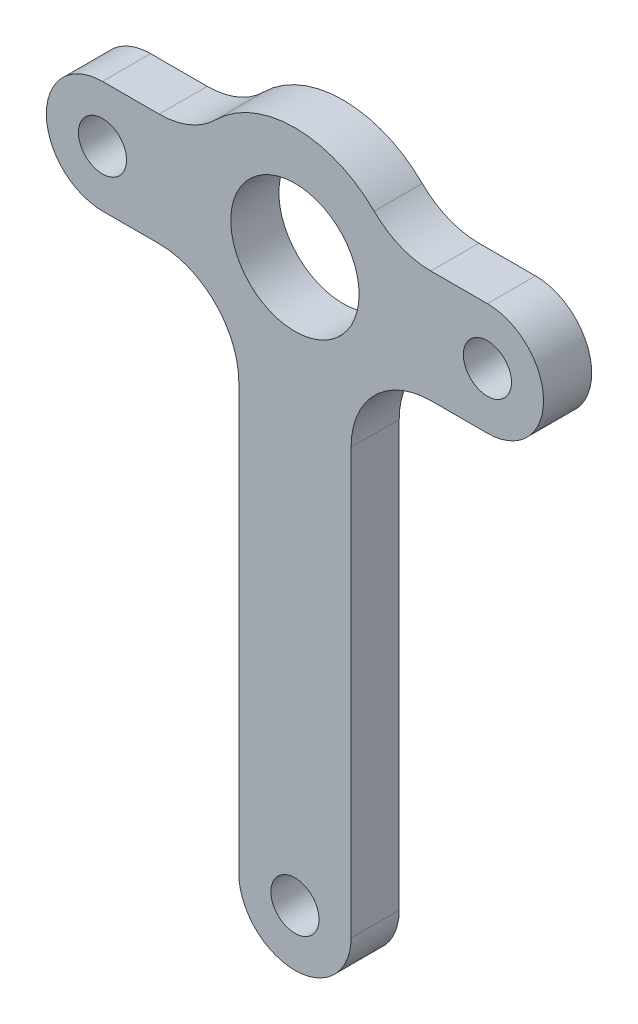
ISO-10303-21;
HEADER;
FILE_DESCRIPTION(('STEP AP214'),'2;1');
FILE_NAME('part.step','',(''),(''),'','','');
FILE_SCHEMA(('AUTOMOTIVE_DESIGN { 1 0 10303 214 1 1 1 1 }'));
ENDSEC;
DATA;
#1=APPLICATION_CONTEXT('core data for automotive mechanical design processes');
#2=APPLICATION_PROTOCOL_DEFINITION('international standard','automotive_design',2000,#1);
#3=PRODUCT_CONTEXT('',#1,'mechanical');
#4=PRODUCT('Part','Part','',(#3));
#5=PRODUCT_RELATED_PRODUCT_CATEGORY('part','',(#4));
#6=PRODUCT_DEFINITION_FORMATION('','',#4);
#7=PRODUCT_DEFINITION_CONTEXT('part definition',#1,'design');
#8=PRODUCT_DEFINITION('design','',#6,#7);
#9=PRODUCT_DEFINITION_SHAPE('','',#8);
#10=(LENGTH_UNIT() NAMED_UNIT(*) SI_UNIT(.MILLI.,.METRE.));
#11=(NAMED_UNIT(*) PLANE_ANGLE_UNIT() SI_UNIT($,.RADIAN.));
#12=(NAMED_UNIT(*) SI_UNIT($,.STERADIAN.) SOLID_ANGLE_UNIT());
#13=UNCERTAINTY_MEASURE_WITH_UNIT(LENGTH_MEASURE(1.E-05),#10,'distance_accuracy_value','');
#14=(GEOMETRIC_REPRESENTATION_CONTEXT(3) GLOBAL_UNCERTAINTY_ASSIGNED_CONTEXT((#13)) GLOBAL_UNIT_ASSIGNED_CONTEXT((#10,
#11,#12)) REPRESENTATION_CONTEXT('',''));
#15=CARTESIAN_POINT('',(0.,0.,0.));
#16=DIRECTION('',(0.,0.,1.));
#17=DIRECTION('',(1.,0.,0.));
#18=AXIS2_PLACEMENT_3D('',#15,#16,#17);
#19=CARTESIAN_POINT('',(-12.,0.,3.));
#20=DIRECTION('',(0.,0.,1.));
#21=DIRECTION('',(1.,0.,0.));
#22=AXIS2_PLACEMENT_3D('',#19,#20,#21);
#23=PLANE('',#22);
#24=CARTESIAN_POINT('',(0.,-35.,3.));
#25=DIRECTION('',(0.,0.,1.));
#26=DIRECTION('',(1.,0.,0.));
#27=AXIS2_PLACEMENT_3D('',#24,#25,#26);
#28=CIRCLE('',#27,1.5);
#29=CARTESIAN_POINT('',(1.50000000000001,-35.,3.));
#30=VERTEX_POINT('',#29);
#31=EDGE_CURVE('E318',#30,#30,#28,.T.);
#32=ORIENTED_EDGE('',*,*,#31,.F.);
#33=EDGE_LOOP('',(#32));
#34=FACE_BOUND('',#33,.T.);
#35=CARTESIAN_POINT('',(0.,0.,3.));
#36=DIRECTION('',(0.,0.,1.));
#37=DIRECTION('',(1.,0.,0.));
#38=AXIS2_PLACEMENT_3D('',#35,#36,#37);
#39=CIRCLE('',#38,4.);
#40=CARTESIAN_POINT('',(4.,0.,3.));
#41=VERTEX_POINT('',#40);
#42=EDGE_CURVE('E171',#41,#41,#39,.T.);
#43=ORIENTED_EDGE('',*,*,#42,.F.);
#44=EDGE_LOOP('',(#43));
#45=FACE_BOUND('',#44,.T.);
#46=CARTESIAN_POINT('',(-12.,0.,3.));
#47=DIRECTION('',(0.,0.,1.));
#48=DIRECTION('',(1.,0.,0.));
#49=AXIS2_PLACEMENT_3D('',#46,#47,#48);
#50=CIRCLE('',#49,3.5);
#51=CARTESIAN_POINT('',(-12.,3.5,3.));
#52=VERTEX_POINT('',#51);
#53=CARTESIAN_POINT('',(-12.,-3.5,3.));
#54=VERTEX_POINT('',#53);
#55=EDGE_CURVE('E194',#52,#54,#50,.T.);
#56=ORIENTED_EDGE('',*,*,#55,.T.);
#57=DIRECTION('',(1.,0.,0.));
#58=VECTOR('',#57,1.);
#59=CARTESIAN_POINT('',(-12.,-3.5,3.));
#60=LINE('',#59,#58);
#61=CARTESIAN_POINT('',(-8.5,-3.5,3.));
#62=VERTEX_POINT('',#61);
#63=EDGE_CURVE('E112',#54,#62,#60,.T.);
#64=ORIENTED_EDGE('',*,*,#63,.T.);
#65=CARTESIAN_POINT('',(-8.5,-8.5,3.));
#66=DIRECTION('',(0.,0.,-1.));
#67=DIRECTION('',(-1.,0.,0.));
#68=AXIS2_PLACEMENT_3D('',#65,#66,#67);
#69=CIRCLE('',#68,5.);
#70=CARTESIAN_POINT('',(-3.5,-8.5,3.));
#71=VERTEX_POINT('',#70);
#72=EDGE_CURVE('E227',#62,#71,#69,.T.);
#73=ORIENTED_EDGE('',*,*,#72,.T.);
#74=DIRECTION('',(0.,-1.,0.));
#75=VECTOR('',#74,1.);
#76=CARTESIAN_POINT('',(-3.5,-8.5,3.));
#77=LINE('',#76,#75);
#78=CARTESIAN_POINT('',(-3.49999999999999,-35.,3.));
#79=VERTEX_POINT('',#78);
#80=EDGE_CURVE('E246',#71,#79,#77,.T.);
#81=ORIENTED_EDGE('',*,*,#80,.T.);
#82=CARTESIAN_POINT('',(0.,-35.,3.));
#83=DIRECTION('',(0.,0.,1.));
#84=DIRECTION('',(1.,0.,0.));
#85=AXIS2_PLACEMENT_3D('',#82,#83,#84);
#86=CIRCLE('',#85,3.5);
#87=CARTESIAN_POINT('',(3.50000000000001,-35.,3.));
#88=VERTEX_POINT('',#87);
#89=EDGE_CURVE('E243',#79,#88,#86,.T.);
#90=ORIENTED_EDGE('',*,*,#89,.T.);
#91=DIRECTION('',(0.,1.,0.));
#92=VECTOR('',#91,1.);
#93=CARTESIAN_POINT('',(3.5,-8.5,3.));
#94=LINE('',#93,#92);
#95=CARTESIAN_POINT('',(3.5,-8.5,3.));
#96=VERTEX_POINT('',#95);
#97=EDGE_CURVE('E245',#88,#96,#94,.T.);
#98=ORIENTED_EDGE('',*,*,#97,.T.);
#99=CARTESIAN_POINT('',(8.5,-8.5,3.));
#100=DIRECTION('',(0.,0.,-1.));
#101=DIRECTION('',(1.,0.,0.));
#102=AXIS2_PLACEMENT_3D('',#99,#100,#101);
#103=CIRCLE('',#102,5.);
#104=CARTESIAN_POINT('',(8.5,-3.5,3.));
#105=VERTEX_POINT('',#104);
#106=EDGE_CURVE('E248',#96,#105,#103,.T.);
#107=ORIENTED_EDGE('',*,*,#106,.T.);
#108=DIRECTION('',(1.,0.,0.));
#109=VECTOR('',#108,1.);
#110=CARTESIAN_POINT('',(12.,-3.5,3.));
#111=LINE('',#110,#109);
#112=CARTESIAN_POINT('',(12.,-3.5,3.));
#113=VERTEX_POINT('',#112);
#114=EDGE_CURVE('E254',#105,#113,#111,.T.);
#115=ORIENTED_EDGE('',*,*,#114,.T.);
#116=CARTESIAN_POINT('',(12.,0.,3.));
#117=DIRECTION('',(0.,0.,1.));
#118=DIRECTION('',(-1.,0.,0.));
#119=AXIS2_PLACEMENT_3D('',#116,#117,#118);
#120=CIRCLE('',#119,3.5);
#121=CARTESIAN_POINT('',(12.,3.5,3.));
#122=VERTEX_POINT('',#121);
#123=EDGE_CURVE('E256',#113,#122,#120,.T.);
#124=ORIENTED_EDGE('',*,*,#123,.T.);
#125=DIRECTION('',(-1.,0.,0.));
#126=VECTOR('',#125,1.);
#127=CARTESIAN_POINT('',(12.,3.5,3.));
#128=LINE('',#127,#126);
#129=CARTESIAN_POINT('',(8.47053717304872,3.5,3.));
#130=VERTEX_POINT('',#129);
#131=EDGE_CURVE('E258',#122,#130,#128,.T.);
#132=ORIENTED_EDGE('',*,*,#131,.T.);
#133=CARTESIAN_POINT('',(8.47053717304871,8.5,3.));
#134=DIRECTION('',(0.,0.,-1.));
#135=DIRECTION('',(-1.,0.,0.));
#136=AXIS2_PLACEMENT_3D('',#133,#134,#135);
#137=CIRCLE('',#136,5.);
#138=CARTESIAN_POINT('',(4.94114668427842,4.95833333333333,3.));
#139=VERTEX_POINT('',#138);
#140=EDGE_CURVE('E149',#130,#139,#137,.T.);
#141=ORIENTED_EDGE('',*,*,#140,.T.);
#142=CARTESIAN_POINT('',(0.,0.,3.));
#143=DIRECTION('',(0.,0.,1.));
#144=DIRECTION('',(-1.,0.,0.));
#145=AXIS2_PLACEMENT_3D('',#142,#143,#144);
#146=CIRCLE('',#145,7.);
#147=CARTESIAN_POINT('',(-4.94114668427841,4.95833333333333,3.));
#148=VERTEX_POINT('',#147);
#149=EDGE_CURVE('E143',#139,#148,#146,.T.);
#150=ORIENTED_EDGE('',*,*,#149,.T.);
#151=CARTESIAN_POINT('',(-8.47053717304871,8.5,3.));
#152=DIRECTION('',(0.,0.,-1.));
#153=DIRECTION('',(-1.,0.,0.));
#154=AXIS2_PLACEMENT_3D('',#151,#152,#153);
#155=CIRCLE('',#154,5.);
#156=CARTESIAN_POINT('',(-8.47053717304871,3.5,3.));
#157=VERTEX_POINT('',#156);
#158=EDGE_CURVE('E147',#148,#157,#155,.T.);
#159=ORIENTED_EDGE('',*,*,#158,.T.);
#160=DIRECTION('',(-1.,0.,0.));
#161=VECTOR('',#160,1.);
#162=CARTESIAN_POINT('',(-12.,3.5,3.));
#163=LINE('',#162,#161);
#164=EDGE_CURVE('E51',#157,#52,#163,.T.);
#165=ORIENTED_EDGE('',*,*,#164,.T.);
#166=EDGE_LOOP('',(#56,#64,#73,#81,#90,#98,#107,#115,#124,#132,#141,#150,#159,#165));
#167=FACE_BOUND('',#166,.T.);
#168=CARTESIAN_POINT('',(-12.,0.,3.));
#169=DIRECTION('',(0.,0.,1.));
#170=DIRECTION('',(1.,0.,0.));
#171=AXIS2_PLACEMENT_3D('',#168,#169,#170);
#172=CIRCLE('',#171,1.5);
#173=CARTESIAN_POINT('',(-10.5,0.,3.));
#174=VERTEX_POINT('',#173);
#175=EDGE_CURVE('E324',#174,#174,#172,.T.);
#176=ORIENTED_EDGE('',*,*,#175,.F.);
#177=EDGE_LOOP('',(#176));
#178=FACE_BOUND('',#177,.T.);
#179=CARTESIAN_POINT('',(12.,0.,3.));
#180=DIRECTION('',(0.,0.,1.));
#181=DIRECTION('',(1.,0.,0.));
#182=AXIS2_PLACEMENT_3D('',#179,#180,#181);
#183=CIRCLE('',#182,1.5);
#184=CARTESIAN_POINT('',(13.5,0.,3.));
#185=VERTEX_POINT('',#184);
#186=EDGE_CURVE('E309',#185,#185,#183,.T.);
#187=ORIENTED_EDGE('',*,*,#186,.F.);
#188=EDGE_LOOP('',(#187));
#189=FACE_BOUND('',#188,.T.);
#190=ADVANCED_FACE('F34',(#34,#45,#167,#178,#189),#23,.T.);
#191=CARTESIAN_POINT('',(-12.,0.,0.));
#192=DIRECTION('',(0.,0.,1.));
#193=DIRECTION('',(1.,0.,0.));
#194=AXIS2_PLACEMENT_3D('',#191,#192,#193);
#195=PLANE('',#194);
#196=CARTESIAN_POINT('',(-12.,0.,0.));
#197=DIRECTION('',(0.,0.,1.));
#198=DIRECTION('',(1.,0.,0.));
#199=AXIS2_PLACEMENT_3D('',#196,#197,#198);
#200=CIRCLE('',#199,3.5);
#201=CARTESIAN_POINT('',(-12.,3.5,0.));
#202=VERTEX_POINT('',#201);
#203=CARTESIAN_POINT('',(-12.,-3.5,0.));
#204=VERTEX_POINT('',#203);
#205=EDGE_CURVE('E167',#202,#204,#200,.T.);
#206=ORIENTED_EDGE('',*,*,#205,.F.);
#207=DIRECTION('',(-1.,0.,0.));
#208=VECTOR('',#207,1.);
#209=CARTESIAN_POINT('',(-12.,3.5,0.));
#210=LINE('',#209,#208);
#211=CARTESIAN_POINT('',(-8.47053717304871,3.5,0.));
#212=VERTEX_POINT('',#211);
#213=EDGE_CURVE('E104',#212,#202,#210,.T.);
#214=ORIENTED_EDGE('',*,*,#213,.F.);
#215=CARTESIAN_POINT('',(-8.47053717304871,8.5,0.));
#216=DIRECTION('',(0.,0.,-1.));
#217=DIRECTION('',(-1.,0.,0.));
#218=AXIS2_PLACEMENT_3D('',#215,#216,#217);
#219=CIRCLE('',#218,5.);
#220=CARTESIAN_POINT('',(-4.94114668427841,4.95833333333333,0.));
#221=VERTEX_POINT('',#220);
#222=EDGE_CURVE('E98',#221,#212,#219,.T.);
#223=ORIENTED_EDGE('',*,*,#222,.F.);
#224=CARTESIAN_POINT('',(0.,0.,0.));
#225=DIRECTION('',(0.,0.,1.));
#226=DIRECTION('',(-1.,0.,0.));
#227=AXIS2_PLACEMENT_3D('',#224,#225,#226);
#228=CIRCLE('',#227,7.);
#229=CARTESIAN_POINT('',(4.94114668427842,4.95833333333333,0.));
#230=VERTEX_POINT('',#229);
#231=EDGE_CURVE('E157',#230,#221,#228,.T.);
#232=ORIENTED_EDGE('',*,*,#231,.F.);
#233=CARTESIAN_POINT('',(8.47053717304871,8.5,0.));
#234=DIRECTION('',(0.,0.,-1.));
#235=DIRECTION('',(-1.,0.,0.));
#236=AXIS2_PLACEMENT_3D('',#233,#234,#235);
#237=CIRCLE('',#236,5.);
#238=CARTESIAN_POINT('',(8.47053717304872,3.5,0.));
#239=VERTEX_POINT('',#238);
#240=EDGE_CURVE('E189',#239,#230,#237,.T.);
#241=ORIENTED_EDGE('',*,*,#240,.F.);
#242=DIRECTION('',(-1.,0.,0.));
#243=VECTOR('',#242,1.);
#244=CARTESIAN_POINT('',(12.,3.5,0.));
#245=LINE('',#244,#243);
#246=CARTESIAN_POINT('',(12.,3.5,0.));
#247=VERTEX_POINT('',#246);
#248=EDGE_CURVE('E187',#247,#239,#245,.T.);
#249=ORIENTED_EDGE('',*,*,#248,.F.);
#250=CARTESIAN_POINT('',(12.,0.,0.));
#251=DIRECTION('',(0.,0.,1.));
#252=DIRECTION('',(-1.,0.,0.));
#253=AXIS2_PLACEMENT_3D('',#250,#251,#252);
#254=CIRCLE('',#253,3.5);
#255=CARTESIAN_POINT('',(12.,-3.5,0.));
#256=VERTEX_POINT('',#255);
#257=EDGE_CURVE('E185',#256,#247,#254,.T.);
#258=ORIENTED_EDGE('',*,*,#257,.F.);
#259=DIRECTION('',(1.,0.,0.));
#260=VECTOR('',#259,1.);
#261=CARTESIAN_POINT('',(12.,-3.5,0.));
#262=LINE('',#261,#260);
#263=CARTESIAN_POINT('',(8.5,-3.5,0.));
#264=VERTEX_POINT('',#263);
#265=EDGE_CURVE('E183',#264,#256,#262,.T.);
#266=ORIENTED_EDGE('',*,*,#265,.F.);
#267=CARTESIAN_POINT('',(8.5,-8.5,0.));
#268=DIRECTION('',(0.,0.,-1.));
#269=DIRECTION('',(1.,0.,0.));
#270=AXIS2_PLACEMENT_3D('',#267,#268,#269);
#271=CIRCLE('',#270,5.);
#272=CARTESIAN_POINT('',(3.5,-8.5,0.));
#273=VERTEX_POINT('',#272);
#274=EDGE_CURVE('E181',#273,#264,#271,.T.);
#275=ORIENTED_EDGE('',*,*,#274,.F.);
#276=DIRECTION('',(0.,1.,0.));
#277=VECTOR('',#276,1.);
#278=CARTESIAN_POINT('',(3.5,-8.5,0.));
#279=LINE('',#278,#277);
#280=CARTESIAN_POINT('',(3.50000000000001,-35.,0.));
#281=VERTEX_POINT('',#280);
#282=EDGE_CURVE('E179',#281,#273,#279,.T.);
#283=ORIENTED_EDGE('',*,*,#282,.F.);
#284=CARTESIAN_POINT('',(0.,-35.,0.));
#285=DIRECTION('',(0.,0.,1.));
#286=DIRECTION('',(1.,0.,0.));
#287=AXIS2_PLACEMENT_3D('',#284,#285,#286);
#288=CIRCLE('',#287,3.5);
#289=CARTESIAN_POINT('',(-3.49999999999999,-35.,0.));
#290=VERTEX_POINT('',#289);
#291=EDGE_CURVE('E177',#290,#281,#288,.T.);
#292=ORIENTED_EDGE('',*,*,#291,.F.);
#293=DIRECTION('',(0.,-1.,0.));
#294=VECTOR('',#293,1.);
#295=CARTESIAN_POINT('',(-3.5,-8.5,0.));
#296=LINE('',#295,#294);
#297=CARTESIAN_POINT('',(-3.5,-8.5,0.));
#298=VERTEX_POINT('',#297);
#299=EDGE_CURVE('E175',#298,#290,#296,.T.);
#300=ORIENTED_EDGE('',*,*,#299,.F.);
#301=CARTESIAN_POINT('',(-8.5,-8.5,0.));
#302=DIRECTION('',(0.,0.,-1.));
#303=DIRECTION('',(-1.,0.,0.));
#304=AXIS2_PLACEMENT_3D('',#301,#302,#303);
#305=CIRCLE('',#304,5.);
#306=CARTESIAN_POINT('',(-8.5,-3.5,0.));
#307=VERTEX_POINT('',#306);
#308=EDGE_CURVE('E173',#307,#298,#305,.T.);
#309=ORIENTED_EDGE('',*,*,#308,.F.);
#310=DIRECTION('',(1.,0.,0.));
#311=VECTOR('',#310,1.);
#312=CARTESIAN_POINT('',(-12.,-3.5,0.));
#313=LINE('',#312,#311);
#314=EDGE_CURVE('E170',#204,#307,#313,.T.);
#315=ORIENTED_EDGE('',*,*,#314,.F.);
#316=EDGE_LOOP('',(#206,#214,#223,#232,#241,#249,#258,#266,#275,#283,#292,#300,#309,#315));
#317=FACE_BOUND('',#316,.T.);
#318=CARTESIAN_POINT('',(0.,0.,0.));
#319=DIRECTION('',(0.,0.,1.));
#320=DIRECTION('',(1.,0.,0.));
#321=AXIS2_PLACEMENT_3D('',#318,#319,#320);
#322=CIRCLE('',#321,4.);
#323=CARTESIAN_POINT('',(4.,0.,0.));
#324=VERTEX_POINT('',#323);
#325=EDGE_CURVE('E327',#324,#324,#322,.T.);
#326=ORIENTED_EDGE('',*,*,#325,.T.);
#327=EDGE_LOOP('',(#326));
#328=FACE_BOUND('',#327,.T.);
#329=CARTESIAN_POINT('',(-12.,0.,0.));
#330=DIRECTION('',(0.,0.,1.));
#331=DIRECTION('',(1.,0.,0.));
#332=AXIS2_PLACEMENT_3D('',#329,#330,#331);
#333=CIRCLE('',#332,1.5);
#334=CARTESIAN_POINT('',(-10.5,0.,0.));
#335=VERTEX_POINT('',#334);
#336=EDGE_CURVE('E321',#335,#335,#333,.T.);
#337=ORIENTED_EDGE('',*,*,#336,.T.);
#338=EDGE_LOOP('',(#337));
#339=FACE_BOUND('',#338,.T.);
#340=CARTESIAN_POINT('',(0.,-35.,0.));
#341=DIRECTION('',(0.,0.,1.));
#342=DIRECTION('',(1.,0.,0.));
#343=AXIS2_PLACEMENT_3D('',#340,#341,#342);
#344=CIRCLE('',#343,1.5);
#345=CARTESIAN_POINT('',(1.50000000000001,-35.,0.));
#346=VERTEX_POINT('',#345);
#347=EDGE_CURVE('E315',#346,#346,#344,.T.);
#348=ORIENTED_EDGE('',*,*,#347,.T.);
#349=EDGE_LOOP('',(#348));
#350=FACE_BOUND('',#349,.T.);
#351=CARTESIAN_POINT('',(12.,0.,0.));
#352=DIRECTION('',(0.,0.,1.));
#353=DIRECTION('',(1.,0.,0.));
#354=AXIS2_PLACEMENT_3D('',#351,#352,#353);
#355=CIRCLE('',#354,1.5);
#356=CARTESIAN_POINT('',(13.5,0.,0.));
#357=VERTEX_POINT('',#356);
#358=EDGE_CURVE('E312',#357,#357,#355,.T.);
#359=ORIENTED_EDGE('',*,*,#358,.T.);
#360=EDGE_LOOP('',(#359));
#361=FACE_BOUND('',#360,.T.);
#362=ADVANCED_FACE('F231',(#317,#328,#339,#350,#361),#195,.F.);
#363=CARTESIAN_POINT('',(-12.,0.,3.));
#364=DIRECTION('',(0.,0.,-1.));
#365=DIRECTION('',(-1.,0.,0.));
#366=AXIS2_PLACEMENT_3D('',#363,#364,#365);
#367=CYLINDRICAL_SURFACE('',#366,3.5);
#368=ORIENTED_EDGE('',*,*,#205,.T.);
#369=DIRECTION('',(0.,0.,-1.));
#370=VECTOR('',#369,1.);
#371=CARTESIAN_POINT('',(-12.,-3.5,3.));
#372=LINE('',#371,#370);
#373=EDGE_CURVE('E11',#54,#204,#372,.T.);
#374=ORIENTED_EDGE('',*,*,#373,.F.);
#375=ORIENTED_EDGE('',*,*,#55,.F.);
#376=DIRECTION('',(0.,0.,-1.));
#377=VECTOR('',#376,1.);
#378=CARTESIAN_POINT('',(-12.,3.5,3.));
#379=LINE('',#378,#377);
#380=EDGE_CURVE('E163',#52,#202,#379,.T.);
#381=ORIENTED_EDGE('',*,*,#380,.T.);
#382=EDGE_LOOP('',(#368,#374,#375,#381));
#383=FACE_BOUND('',#382,.T.);
#384=ADVANCED_FACE('F36',(#383),#367,.T.);
#385=CARTESIAN_POINT('',(-12.,-3.5,3.));
#386=DIRECTION('',(0.,1.,0.));
#387=DIRECTION('',(-1.,0.,0.));
#388=AXIS2_PLACEMENT_3D('',#385,#386,#387);
#389=PLANE('',#388);
#390=ORIENTED_EDGE('',*,*,#314,.T.);
#391=DIRECTION('',(0.,0.,-1.));
#392=VECTOR('',#391,1.);
#393=CARTESIAN_POINT('',(-8.5,-3.5,3.));
#394=LINE('',#393,#392);
#395=EDGE_CURVE('E43',#62,#307,#394,.T.);
#396=ORIENTED_EDGE('',*,*,#395,.F.);
#397=ORIENTED_EDGE('',*,*,#63,.F.);
#398=ORIENTED_EDGE('',*,*,#373,.T.);
#399=EDGE_LOOP('',(#390,#396,#397,#398));
#400=FACE_BOUND('',#399,.T.);
#401=ADVANCED_FACE('F457',(#400),#389,.F.);
#402=CARTESIAN_POINT('',(-8.5,-8.5,3.));
#403=DIRECTION('',(0.,0.,-1.));
#404=DIRECTION('',(-1.,0.,0.));
#405=AXIS2_PLACEMENT_3D('',#402,#403,#404);
#406=CYLINDRICAL_SURFACE('',#405,5.);
#407=ORIENTED_EDGE('',*,*,#308,.T.);
#408=DIRECTION('',(0.,0.,-1.));
#409=VECTOR('',#408,1.);
#410=CARTESIAN_POINT('',(-3.5,-8.5,3.));
#411=LINE('',#410,#409);
#412=EDGE_CURVE('E219',#71,#298,#411,.T.);
#413=ORIENTED_EDGE('',*,*,#412,.F.);
#414=ORIENTED_EDGE('',*,*,#72,.F.);
#415=ORIENTED_EDGE('',*,*,#395,.T.);
#416=EDGE_LOOP('',(#407,#413,#414,#415));
#417=FACE_BOUND('',#416,.T.);
#418=ADVANCED_FACE('F225',(#417),#406,.F.);
#419=CARTESIAN_POINT('',(-3.5,-8.5,3.));
#420=DIRECTION('',(1.,0.,0.));
#421=DIRECTION('',(0.,1.,0.));
#422=AXIS2_PLACEMENT_3D('',#419,#420,#421);
#423=PLANE('',#422);
#424=ORIENTED_EDGE('',*,*,#299,.T.);
#425=DIRECTION('',(0.,0.,-1.));
#426=VECTOR('',#425,1.);
#427=CARTESIAN_POINT('',(-3.49999999999999,-35.,3.));
#428=LINE('',#427,#426);
#429=EDGE_CURVE('E216',#79,#290,#428,.T.);
#430=ORIENTED_EDGE('',*,*,#429,.F.);
#431=ORIENTED_EDGE('',*,*,#80,.F.);
#432=ORIENTED_EDGE('',*,*,#412,.T.);
#433=EDGE_LOOP('',(#424,#430,#431,#432));
#434=FACE_BOUND('',#433,.T.);
#435=ADVANCED_FACE('F237',(#434),#423,.F.);
#436=CARTESIAN_POINT('',(0.,-35.,3.));
#437=DIRECTION('',(0.,0.,-1.));
#438=DIRECTION('',(-1.,0.,0.));
#439=AXIS2_PLACEMENT_3D('',#436,#437,#438);
#440=CYLINDRICAL_SURFACE('',#439,3.5);
#441=ORIENTED_EDGE('',*,*,#291,.T.);
#442=DIRECTION('',(0.,0.,-1.));
#443=VECTOR('',#442,1.);
#444=CARTESIAN_POINT('',(3.50000000000001,-35.,3.));
#445=LINE('',#444,#443);
#446=EDGE_CURVE('E213',#88,#281,#445,.T.);
#447=ORIENTED_EDGE('',*,*,#446,.F.);
#448=ORIENTED_EDGE('',*,*,#89,.F.);
#449=ORIENTED_EDGE('',*,*,#429,.T.);
#450=EDGE_LOOP('',(#441,#447,#448,#449));
#451=FACE_BOUND('',#450,.T.);
#452=ADVANCED_FACE('F241',(#451),#440,.T.);
#453=CARTESIAN_POINT('',(3.5,-8.5,3.));
#454=DIRECTION('',(-1.,0.,0.));
#455=DIRECTION('',(0.,-1.,0.));
#456=AXIS2_PLACEMENT_3D('',#453,#454,#455);
#457=PLANE('',#456);
#458=ORIENTED_EDGE('',*,*,#282,.T.);
#459=DIRECTION('',(0.,0.,-1.));
#460=VECTOR('',#459,1.);
#461=CARTESIAN_POINT('',(3.5,-8.5,3.));
#462=LINE('',#461,#460);
#463=EDGE_CURVE('E210',#96,#273,#462,.T.);
#464=ORIENTED_EDGE('',*,*,#463,.F.);
#465=ORIENTED_EDGE('',*,*,#97,.F.);
#466=ORIENTED_EDGE('',*,*,#446,.T.);
#467=EDGE_LOOP('',(#458,#464,#465,#466));
#468=FACE_BOUND('',#467,.T.);
#469=ADVANCED_FACE('F422',(#468),#457,.F.);
#470=CARTESIAN_POINT('',(8.5,-8.5,3.));
#471=DIRECTION('',(0.,0.,-1.));
#472=DIRECTION('',(-1.,0.,0.));
#473=AXIS2_PLACEMENT_3D('',#470,#471,#472);
#474=CYLINDRICAL_SURFACE('',#473,5.);
#475=ORIENTED_EDGE('',*,*,#274,.T.);
#476=DIRECTION('',(0.,0.,-1.));
#477=VECTOR('',#476,1.);
#478=CARTESIAN_POINT('',(8.5,-3.5,3.));
#479=LINE('',#478,#477);
#480=EDGE_CURVE('E207',#105,#264,#479,.T.);
#481=ORIENTED_EDGE('',*,*,#480,.F.);
#482=ORIENTED_EDGE('',*,*,#106,.F.);
#483=ORIENTED_EDGE('',*,*,#463,.T.);
#484=EDGE_LOOP('',(#475,#481,#482,#483));
#485=FACE_BOUND('',#484,.T.);
#486=ADVANCED_FACE('F412',(#485),#474,.F.);
#487=CARTESIAN_POINT('',(12.,-3.5,3.));
#488=DIRECTION('',(0.,1.,0.));
#489=DIRECTION('',(-1.,0.,0.));
#490=AXIS2_PLACEMENT_3D('',#487,#488,#489);
#491=PLANE('',#490);
#492=ORIENTED_EDGE('',*,*,#265,.T.);
#493=DIRECTION('',(0.,0.,-1.));
#494=VECTOR('',#493,1.);
#495=CARTESIAN_POINT('',(12.,-3.5,3.));
#496=LINE('',#495,#494);
#497=EDGE_CURVE('E204',#113,#256,#496,.T.);
#498=ORIENTED_EDGE('',*,*,#497,.F.);
#499=ORIENTED_EDGE('',*,*,#114,.F.);
#500=ORIENTED_EDGE('',*,*,#480,.T.);
#501=EDGE_LOOP('',(#492,#498,#499,#500));
#502=FACE_BOUND('',#501,.T.);
#503=ADVANCED_FACE('F402',(#502),#491,.F.);
#504=CARTESIAN_POINT('',(12.,0.,3.));
#505=DIRECTION('',(0.,0.,-1.));
#506=DIRECTION('',(-1.,0.,0.));
#507=AXIS2_PLACEMENT_3D('',#504,#505,#506);
#508=CYLINDRICAL_SURFACE('',#507,3.5);
#509=ORIENTED_EDGE('',*,*,#257,.T.);
#510=DIRECTION('',(0.,0.,-1.));
#511=VECTOR('',#510,1.);
#512=CARTESIAN_POINT('',(12.,3.5,3.));
#513=LINE('',#512,#511);
#514=EDGE_CURVE('E201',#122,#247,#513,.T.);
#515=ORIENTED_EDGE('',*,*,#514,.F.);
#516=ORIENTED_EDGE('',*,*,#123,.F.);
#517=ORIENTED_EDGE('',*,*,#497,.T.);
#518=EDGE_LOOP('',(#509,#515,#516,#517));
#519=FACE_BOUND('',#518,.T.);
#520=ADVANCED_FACE('F393',(#519),#508,.T.);
#521=CARTESIAN_POINT('',(12.,3.5,3.));
#522=DIRECTION('',(0.,-1.,0.));
#523=DIRECTION('',(1.,0.,0.));
#524=AXIS2_PLACEMENT_3D('',#521,#522,#523);
#525=PLANE('',#524);
#526=ORIENTED_EDGE('',*,*,#248,.T.);
#527=DIRECTION('',(0.,0.,-1.));
#528=VECTOR('',#527,1.);
#529=CARTESIAN_POINT('',(8.47053717304872,3.5,3.));
#530=LINE('',#529,#528);
#531=EDGE_CURVE('E198',#130,#239,#530,.T.);
#532=ORIENTED_EDGE('',*,*,#531,.F.);
#533=ORIENTED_EDGE('',*,*,#131,.F.);
#534=ORIENTED_EDGE('',*,*,#514,.T.);
#535=EDGE_LOOP('',(#526,#532,#533,#534));
#536=FACE_BOUND('',#535,.T.);
#537=ADVANCED_FACE('F264',(#536),#525,.F.);
#538=CARTESIAN_POINT('',(8.47053717304871,8.5,3.));
#539=DIRECTION('',(0.,0.,-1.));
#540=DIRECTION('',(-1.,0.,0.));
#541=AXIS2_PLACEMENT_3D('',#538,#539,#540);
#542=CYLINDRICAL_SURFACE('',#541,5.);
#543=ORIENTED_EDGE('',*,*,#240,.T.);
#544=DIRECTION('',(0.,0.,-1.));
#545=VECTOR('',#544,1.);
#546=CARTESIAN_POINT('',(4.94114668427842,4.95833333333333,3.));
#547=LINE('',#546,#545);
#548=EDGE_CURVE('E158',#139,#230,#547,.T.);
#549=ORIENTED_EDGE('',*,*,#548,.F.);
#550=ORIENTED_EDGE('',*,*,#140,.F.);
#551=ORIENTED_EDGE('',*,*,#531,.T.);
#552=EDGE_LOOP('',(#543,#549,#550,#551));
#553=FACE_BOUND('',#552,.T.);
#554=ADVANCED_FACE('F268',(#553),#542,.F.);
#555=CARTESIAN_POINT('',(0.,0.,3.));
#556=DIRECTION('',(0.,0.,-1.));
#557=DIRECTION('',(-1.,0.,0.));
#558=AXIS2_PLACEMENT_3D('',#555,#556,#557);
#559=CYLINDRICAL_SURFACE('',#558,7.);
#560=ORIENTED_EDGE('',*,*,#231,.T.);
#561=DIRECTION('',(0.,0.,-1.));
#562=VECTOR('',#561,1.);
#563=CARTESIAN_POINT('',(-4.94114668427841,4.95833333333333,3.));
#564=LINE('',#563,#562);
#565=EDGE_CURVE('E154',#148,#221,#564,.T.);
#566=ORIENTED_EDGE('',*,*,#565,.F.);
#567=ORIENTED_EDGE('',*,*,#149,.F.);
#568=ORIENTED_EDGE('',*,*,#548,.T.);
#569=EDGE_LOOP('',(#560,#566,#567,#568));
#570=FACE_BOUND('',#569,.T.);
#571=ADVANCED_FACE('F155',(#570),#559,.T.);
#572=CARTESIAN_POINT('',(-8.47053717304871,8.5,3.));
#573=DIRECTION('',(0.,0.,-1.));
#574=DIRECTION('',(-1.,0.,0.));
#575=AXIS2_PLACEMENT_3D('',#572,#573,#574);
#576=CYLINDRICAL_SURFACE('',#575,5.);
#577=ORIENTED_EDGE('',*,*,#222,.T.);
#578=DIRECTION('',(0.,0.,-1.));
#579=VECTOR('',#578,1.);
#580=CARTESIAN_POINT('',(-8.47053717304871,3.5,3.));
#581=LINE('',#580,#579);
#582=EDGE_CURVE('E159',#157,#212,#581,.T.);
#583=ORIENTED_EDGE('',*,*,#582,.F.);
#584=ORIENTED_EDGE('',*,*,#158,.F.);
#585=ORIENTED_EDGE('',*,*,#565,.T.);
#586=EDGE_LOOP('',(#577,#583,#584,#585));
#587=FACE_BOUND('',#586,.T.);
#588=ADVANCED_FACE('F161',(#587),#576,.F.);
#589=CARTESIAN_POINT('',(-12.,3.5,3.));
#590=DIRECTION('',(0.,-1.,0.));
#591=DIRECTION('',(0.,0.,-1.));
#592=AXIS2_PLACEMENT_3D('',#589,#590,#591);
#593=PLANE('',#592);
#594=ORIENTED_EDGE('',*,*,#213,.T.);
#595=ORIENTED_EDGE('',*,*,#380,.F.);
#596=ORIENTED_EDGE('',*,*,#164,.F.);
#597=ORIENTED_EDGE('',*,*,#582,.T.);
#598=EDGE_LOOP('',(#594,#595,#596,#597));
#599=FACE_BOUND('',#598,.T.);
#600=ADVANCED_FACE('F272',(#599),#593,.F.);
#601=CARTESIAN_POINT('',(0.,0.,3.));
#602=DIRECTION('',(0.,0.,-1.));
#603=DIRECTION('',(-1.,0.,0.));
#604=AXIS2_PLACEMENT_3D('',#601,#602,#603);
#605=CYLINDRICAL_SURFACE('',#604,4.);
#606=ORIENTED_EDGE('',*,*,#42,.T.);
#607=EDGE_LOOP('',(#606));
#608=FACE_BOUND('',#607,.T.);
#609=ORIENTED_EDGE('',*,*,#325,.F.);
#610=EDGE_LOOP('',(#609));
#611=FACE_BOUND('',#610,.T.);
#612=ADVANCED_FACE('F274',(#608,#611),#605,.F.);
#613=CARTESIAN_POINT('',(-12.,0.,3.));
#614=DIRECTION('',(0.,0.,-1.));
#615=DIRECTION('',(-1.,0.,0.));
#616=AXIS2_PLACEMENT_3D('',#613,#614,#615);
#617=CYLINDRICAL_SURFACE('',#616,1.5);
#618=ORIENTED_EDGE('',*,*,#175,.T.);
#619=EDGE_LOOP('',(#618));
#620=FACE_BOUND('',#619,.T.);
#621=ORIENTED_EDGE('',*,*,#336,.F.);
#622=EDGE_LOOP('',(#621));
#623=FACE_BOUND('',#622,.T.);
#624=ADVANCED_FACE('F280',(#620,#623),#617,.F.);
#625=CARTESIAN_POINT('',(0.,-35.,3.));
#626=DIRECTION('',(0.,0.,-1.));
#627=DIRECTION('',(-1.,0.,0.));
#628=AXIS2_PLACEMENT_3D('',#625,#626,#627);
#629=CYLINDRICAL_SURFACE('',#628,1.5);
#630=ORIENTED_EDGE('',*,*,#31,.T.);
#631=EDGE_LOOP('',(#630));
#632=FACE_BOUND('',#631,.T.);
#633=ORIENTED_EDGE('',*,*,#347,.F.);
#634=EDGE_LOOP('',(#633));
#635=FACE_BOUND('',#634,.T.);
#636=ADVANCED_FACE('F296',(#632,#635),#629,.F.);
#637=CARTESIAN_POINT('',(12.,0.,3.));
#638=DIRECTION('',(0.,0.,-1.));
#639=DIRECTION('',(-1.,0.,0.));
#640=AXIS2_PLACEMENT_3D('',#637,#638,#639);
#641=CYLINDRICAL_SURFACE('',#640,1.5);
#642=ORIENTED_EDGE('',*,*,#186,.T.);
#643=EDGE_LOOP('',(#642));
#644=FACE_BOUND('',#643,.T.);
#645=ORIENTED_EDGE('',*,*,#358,.F.);
#646=EDGE_LOOP('',(#645));
#647=FACE_BOUND('',#646,.T.);
#648=ADVANCED_FACE('F300',(#644,#647),#641,.F.);
#649=CLOSED_SHELL('',(#190,#362,#384,#401,#418,#435,#452,#469,#486,#503,#520,#537,#554,#571,
#588,#600,#612,#624,#636,#648));
#650=MANIFOLD_SOLID_BREP('B2',#649);
#651=ADVANCED_BREP_SHAPE_REPRESENTATION('',(#18,#650),#14);
#652=SHAPE_DEFINITION_REPRESENTATION(#9,#651);
ENDSEC;
END-ISO-10303-21;
